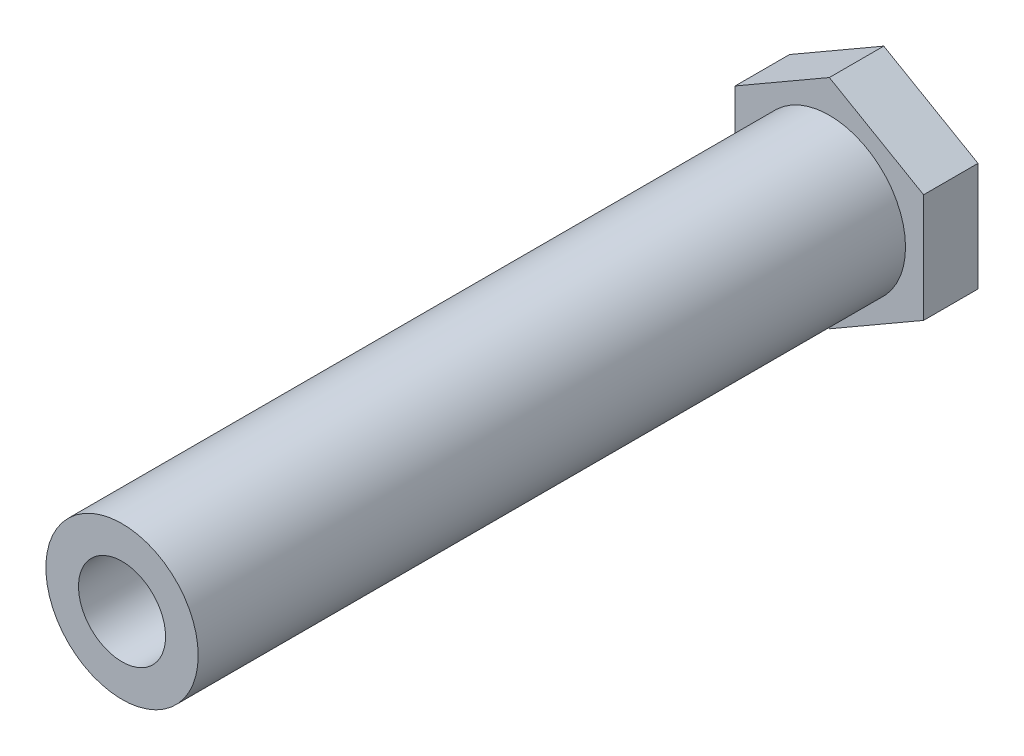
ISO-10303-21;
HEADER;
FILE_DESCRIPTION(('STEP AP214'),'2;1');
FILE_NAME('part.step','',(''),(''),'','','');
FILE_SCHEMA(('AUTOMOTIVE_DESIGN { 1 0 10303 214 1 1 1 1 }'));
ENDSEC;
DATA;
#1=APPLICATION_CONTEXT('core data for automotive mechanical design processes');
#2=APPLICATION_PROTOCOL_DEFINITION('international standard','automotive_design',2000,#1);
#3=PRODUCT_CONTEXT('',#1,'mechanical');
#4=PRODUCT('Part','Part','',(#3));
#5=PRODUCT_RELATED_PRODUCT_CATEGORY('part','',(#4));
#6=PRODUCT_DEFINITION_FORMATION('','',#4);
#7=PRODUCT_DEFINITION_CONTEXT('part definition',#1,'design');
#8=PRODUCT_DEFINITION('design','',#6,#7);
#9=PRODUCT_DEFINITION_SHAPE('','',#8);
#10=(LENGTH_UNIT() NAMED_UNIT(*) SI_UNIT(.MILLI.,.METRE.));
#11=(NAMED_UNIT(*) PLANE_ANGLE_UNIT() SI_UNIT($,.RADIAN.));
#12=(NAMED_UNIT(*) SI_UNIT($,.STERADIAN.) SOLID_ANGLE_UNIT());
#13=UNCERTAINTY_MEASURE_WITH_UNIT(LENGTH_MEASURE(1.E-05),#10,'distance_accuracy_value','');
#14=(GEOMETRIC_REPRESENTATION_CONTEXT(3) GLOBAL_UNCERTAINTY_ASSIGNED_CONTEXT((#13)) GLOBAL_UNIT_ASSIGNED_CONTEXT((#10,
#11,#12)) REPRESENTATION_CONTEXT('',''));
#15=CARTESIAN_POINT('',(0.,0.,0.));
#16=DIRECTION('',(0.,0.,1.));
#17=DIRECTION('',(1.,0.,0.));
#18=AXIS2_PLACEMENT_3D('',#15,#16,#17);
#19=CARTESIAN_POINT('',(8.66025403784438,0.,5.));
#20=DIRECTION('',(-1.,0.,0.));
#21=DIRECTION('',(0.,-1.,0.));
#22=AXIS2_PLACEMENT_3D('',#19,#20,#21);
#23=PLANE('',#22);
#24=DIRECTION('',(0.,1.,0.));
#25=VECTOR('',#24,1.);
#26=CARTESIAN_POINT('',(8.66025403784438,0.,0.));
#27=LINE('',#26,#25);
#28=CARTESIAN_POINT('',(8.66025403784443,-4.99999999999992,0.));
#29=VERTEX_POINT('',#28);
#30=CARTESIAN_POINT('',(8.66025403784433,5.0000000000001,0.));
#31=VERTEX_POINT('',#30);
#32=EDGE_CURVE('E130',#29,#31,#27,.T.);
#33=ORIENTED_EDGE('',*,*,#32,.T.);
#34=DIRECTION('',(0.,0.,-1.));
#35=VECTOR('',#34,1.);
#36=CARTESIAN_POINT('',(8.66025403784433,5.0000000000001,5.));
#37=LINE('',#36,#35);
#38=CARTESIAN_POINT('',(8.66025403784433,5.0000000000001,5.));
#39=VERTEX_POINT('',#38);
#40=EDGE_CURVE('E13',#39,#31,#37,.T.);
#41=ORIENTED_EDGE('',*,*,#40,.F.);
#42=DIRECTION('',(0.,1.,0.));
#43=VECTOR('',#42,1.);
#44=CARTESIAN_POINT('',(8.66025403784438,0.,5.));
#45=LINE('',#44,#43);
#46=CARTESIAN_POINT('',(8.66025403784443,-4.99999999999992,5.));
#47=VERTEX_POINT('',#46);
#48=EDGE_CURVE('E141',#47,#39,#45,.T.);
#49=ORIENTED_EDGE('',*,*,#48,.F.);
#50=DIRECTION('',(0.,0.,-1.));
#51=VECTOR('',#50,1.);
#52=CARTESIAN_POINT('',(8.66025403784443,-4.99999999999992,5.));
#53=LINE('',#52,#51);
#54=EDGE_CURVE('E126',#47,#29,#53,.T.);
#55=ORIENTED_EDGE('',*,*,#54,.T.);
#56=EDGE_LOOP('',(#33,#41,#49,#55));
#57=FACE_BOUND('',#56,.T.);
#58=ADVANCED_FACE('F46',(#57),#23,.F.);
#59=CARTESIAN_POINT('',(4.33012701892216,7.50000000000005,5.));
#60=DIRECTION('',(-0.499999999999995,-0.866025403784442,0.));
#61=DIRECTION('',(0.866025403784442,-0.499999999999995,0.));
#62=AXIS2_PLACEMENT_3D('',#59,#60,#61);
#63=PLANE('',#62);
#64=DIRECTION('',(-0.866025403784442,0.499999999999995,0.));
#65=VECTOR('',#64,1.);
#66=CARTESIAN_POINT('',(4.33012701892216,7.50000000000005,0.));
#67=LINE('',#66,#65);
#68=CARTESIAN_POINT('',(0.,10.,0.));
#69=VERTEX_POINT('',#68);
#70=EDGE_CURVE('E133',#31,#69,#67,.T.);
#71=ORIENTED_EDGE('',*,*,#70,.T.);
#72=DIRECTION('',(0.,0.,-1.));
#73=VECTOR('',#72,1.);
#74=CARTESIAN_POINT('',(0.,10.,5.));
#75=LINE('',#74,#73);
#76=CARTESIAN_POINT('',(0.,10.,5.));
#77=VERTEX_POINT('',#76);
#78=EDGE_CURVE('E54',#77,#69,#75,.T.);
#79=ORIENTED_EDGE('',*,*,#78,.F.);
#80=DIRECTION('',(-0.866025403784442,0.499999999999995,0.));
#81=VECTOR('',#80,1.);
#82=CARTESIAN_POINT('',(4.33012701892216,7.50000000000005,5.));
#83=LINE('',#82,#81);
#84=EDGE_CURVE('E99',#39,#77,#83,.T.);
#85=ORIENTED_EDGE('',*,*,#84,.F.);
#86=ORIENTED_EDGE('',*,*,#40,.T.);
#87=EDGE_LOOP('',(#71,#79,#85,#86));
#88=FACE_BOUND('',#87,.T.);
#89=ADVANCED_FACE('F166',(#88),#63,.F.);
#90=CARTESIAN_POINT('',(-4.3301270189222,7.49999999999999,5.));
#91=DIRECTION('',(0.500000000000001,-0.866025403784438,0.));
#92=DIRECTION('',(0.866025403784438,0.500000000000001,0.));
#93=AXIS2_PLACEMENT_3D('',#90,#91,#92);
#94=PLANE('',#93);
#95=DIRECTION('',(-0.866025403784438,-0.500000000000001,0.));
#96=VECTOR('',#95,1.);
#97=CARTESIAN_POINT('',(-4.3301270189222,7.49999999999999,0.));
#98=LINE('',#97,#96);
#99=CARTESIAN_POINT('',(-8.6602540378444,4.99999999999998,0.));
#100=VERTEX_POINT('',#99);
#101=EDGE_CURVE('E136',#69,#100,#98,.T.);
#102=ORIENTED_EDGE('',*,*,#101,.T.);
#103=DIRECTION('',(0.,0.,-1.));
#104=VECTOR('',#103,1.);
#105=CARTESIAN_POINT('',(-8.6602540378444,4.99999999999998,5.));
#106=LINE('',#105,#104);
#107=CARTESIAN_POINT('',(-8.6602540378444,4.99999999999998,5.));
#108=VERTEX_POINT('',#107);
#109=EDGE_CURVE('E121',#108,#100,#106,.T.);
#110=ORIENTED_EDGE('',*,*,#109,.F.);
#111=DIRECTION('',(-0.866025403784438,-0.500000000000001,0.));
#112=VECTOR('',#111,1.);
#113=CARTESIAN_POINT('',(-4.3301270189222,7.49999999999999,5.));
#114=LINE('',#113,#112);
#115=EDGE_CURVE('E112',#77,#108,#114,.T.);
#116=ORIENTED_EDGE('',*,*,#115,.F.);
#117=ORIENTED_EDGE('',*,*,#78,.T.);
#118=EDGE_LOOP('',(#102,#110,#116,#117));
#119=FACE_BOUND('',#118,.T.);
#120=ADVANCED_FACE('F147',(#119),#94,.F.);
#121=CARTESIAN_POINT('',(-8.66025403784438,0.,5.));
#122=DIRECTION('',(1.,0.,0.));
#123=DIRECTION('',(0.,1.,0.));
#124=AXIS2_PLACEMENT_3D('',#121,#122,#123);
#125=PLANE('',#124);
#126=DIRECTION('',(0.,-1.,0.));
#127=VECTOR('',#126,1.);
#128=CARTESIAN_POINT('',(-8.66025403784438,0.,0.));
#129=LINE('',#128,#127);
#130=CARTESIAN_POINT('',(-8.66025403784436,-5.00000000000004,0.));
#131=VERTEX_POINT('',#130);
#132=EDGE_CURVE('E120',#100,#131,#129,.T.);
#133=ORIENTED_EDGE('',*,*,#132,.T.);
#134=DIRECTION('',(0.,0.,-1.));
#135=VECTOR('',#134,1.);
#136=CARTESIAN_POINT('',(-8.66025403784436,-5.00000000000004,5.));
#137=LINE('',#136,#135);
#138=CARTESIAN_POINT('',(-8.66025403784436,-5.00000000000004,5.));
#139=VERTEX_POINT('',#138);
#140=EDGE_CURVE('E117',#139,#131,#137,.T.);
#141=ORIENTED_EDGE('',*,*,#140,.F.);
#142=DIRECTION('',(0.,-1.,0.));
#143=VECTOR('',#142,1.);
#144=CARTESIAN_POINT('',(-8.66025403784438,0.,5.));
#145=LINE('',#144,#143);
#146=EDGE_CURVE('E106',#108,#139,#145,.T.);
#147=ORIENTED_EDGE('',*,*,#146,.F.);
#148=ORIENTED_EDGE('',*,*,#109,.T.);
#149=EDGE_LOOP('',(#133,#141,#147,#148));
#150=FACE_BOUND('',#149,.T.);
#151=ADVANCED_FACE('F118',(#150),#125,.F.);
#152=CARTESIAN_POINT('',(-4.33012701892215,-7.50000000000002,5.));
#153=DIRECTION('',(0.499999999999995,0.866025403784442,0.));
#154=DIRECTION('',(-0.866025403784442,0.499999999999995,0.));
#155=AXIS2_PLACEMENT_3D('',#152,#153,#154);
#156=PLANE('',#155);
#157=DIRECTION('',(0.866025403784442,-0.499999999999995,0.));
#158=VECTOR('',#157,1.);
#159=CARTESIAN_POINT('',(-4.33012701892215,-7.50000000000002,0.));
#160=LINE('',#159,#158);
#161=CARTESIAN_POINT('',(0.,-10.,0.));
#162=VERTEX_POINT('',#161);
#163=EDGE_CURVE('E85',#131,#162,#160,.T.);
#164=ORIENTED_EDGE('',*,*,#163,.T.);
#165=DIRECTION('',(0.,0.,-1.));
#166=VECTOR('',#165,1.);
#167=CARTESIAN_POINT('',(0.,-10.,5.));
#168=LINE('',#167,#166);
#169=CARTESIAN_POINT('',(0.,-10.,5.));
#170=VERTEX_POINT('',#169);
#171=EDGE_CURVE('E122',#170,#162,#168,.T.);
#172=ORIENTED_EDGE('',*,*,#171,.F.);
#173=DIRECTION('',(0.866025403784442,-0.499999999999995,0.));
#174=VECTOR('',#173,1.);
#175=CARTESIAN_POINT('',(-4.33012701892215,-7.50000000000002,5.));
#176=LINE('',#175,#174);
#177=EDGE_CURVE('E110',#139,#170,#176,.T.);
#178=ORIENTED_EDGE('',*,*,#177,.F.);
#179=ORIENTED_EDGE('',*,*,#140,.T.);
#180=EDGE_LOOP('',(#164,#172,#178,#179));
#181=FACE_BOUND('',#180,.T.);
#182=ADVANCED_FACE('F124',(#181),#156,.F.);
#183=CARTESIAN_POINT('',(4.33012701892225,-7.49999999999996,5.));
#184=DIRECTION('',(-0.500000000000007,0.866025403784434,0.));
#185=DIRECTION('',(-0.866025403784435,-0.500000000000007,0.));
#186=AXIS2_PLACEMENT_3D('',#183,#184,#185);
#187=PLANE('',#186);
#188=DIRECTION('',(0.866025403784435,0.500000000000007,0.));
#189=VECTOR('',#188,1.);
#190=CARTESIAN_POINT('',(4.33012701892225,-7.49999999999996,0.));
#191=LINE('',#190,#189);
#192=EDGE_CURVE('E91',#162,#29,#191,.T.);
#193=ORIENTED_EDGE('',*,*,#192,.T.);
#194=ORIENTED_EDGE('',*,*,#54,.F.);
#195=DIRECTION('',(0.866025403784435,0.500000000000007,0.));
#196=VECTOR('',#195,1.);
#197=CARTESIAN_POINT('',(4.33012701892225,-7.49999999999996,5.));
#198=LINE('',#197,#196);
#199=EDGE_CURVE('E62',#170,#47,#198,.T.);
#200=ORIENTED_EDGE('',*,*,#199,.F.);
#201=ORIENTED_EDGE('',*,*,#171,.T.);
#202=EDGE_LOOP('',(#193,#194,#200,#201));
#203=FACE_BOUND('',#202,.T.);
#204=ADVANCED_FACE('F154',(#203),#187,.F.);
#205=CARTESIAN_POINT('',(0.,0.,5.));
#206=DIRECTION('',(0.,0.,1.));
#207=DIRECTION('',(1.,0.,0.));
#208=AXIS2_PLACEMENT_3D('',#205,#206,#207);
#209=PLANE('',#208);
#210=CARTESIAN_POINT('',(0.,0.,5.));
#211=DIRECTION('',(0.,0.,1.));
#212=DIRECTION('',(1.,0.,0.));
#213=AXIS2_PLACEMENT_3D('',#210,#211,#212);
#214=CIRCLE('',#213,7.);
#215=CARTESIAN_POINT('',(7.,0.,5.));
#216=VERTEX_POINT('',#215);
#217=EDGE_CURVE('E248',#216,#216,#214,.T.);
#218=ORIENTED_EDGE('',*,*,#217,.F.);
#219=EDGE_LOOP('',(#218));
#220=FACE_BOUND('',#219,.T.);
#221=ORIENTED_EDGE('',*,*,#48,.T.);
#222=ORIENTED_EDGE('',*,*,#84,.T.);
#223=ORIENTED_EDGE('',*,*,#115,.T.);
#224=ORIENTED_EDGE('',*,*,#146,.T.);
#225=ORIENTED_EDGE('',*,*,#177,.T.);
#226=ORIENTED_EDGE('',*,*,#199,.T.);
#227=EDGE_LOOP('',(#221,#222,#223,#224,#225,#226));
#228=FACE_BOUND('',#227,.T.);
#229=ADVANCED_FACE('F108',(#220,#228),#209,.T.);
#230=CARTESIAN_POINT('',(0.,0.,0.));
#231=DIRECTION('',(0.,0.,1.));
#232=DIRECTION('',(1.,0.,0.));
#233=AXIS2_PLACEMENT_3D('',#230,#231,#232);
#234=PLANE('',#233);
#235=ORIENTED_EDGE('',*,*,#32,.F.);
#236=ORIENTED_EDGE('',*,*,#192,.F.);
#237=ORIENTED_EDGE('',*,*,#163,.F.);
#238=ORIENTED_EDGE('',*,*,#132,.F.);
#239=ORIENTED_EDGE('',*,*,#101,.F.);
#240=ORIENTED_EDGE('',*,*,#70,.F.);
#241=EDGE_LOOP('',(#235,#236,#237,#238,#239,#240));
#242=FACE_BOUND('',#241,.T.);
#243=ADVANCED_FACE('F150',(#242),#234,.F.);
#244=CARTESIAN_POINT('',(0.,0.,70.));
#245=DIRECTION('',(0.,0.,-1.));
#246=DIRECTION('',(-1.,0.,0.));
#247=AXIS2_PLACEMENT_3D('',#244,#245,#246);
#248=CYLINDRICAL_SURFACE('',#247,7.);
#249=CARTESIAN_POINT('',(0.,0.,70.));
#250=DIRECTION('',(0.,0.,1.));
#251=DIRECTION('',(1.,0.,0.));
#252=AXIS2_PLACEMENT_3D('',#249,#250,#251);
#253=CIRCLE('',#252,7.);
#254=CARTESIAN_POINT('',(7.,0.,70.));
#255=VERTEX_POINT('',#254);
#256=EDGE_CURVE('E134',#255,#255,#253,.T.);
#257=ORIENTED_EDGE('',*,*,#256,.F.);
#258=EDGE_LOOP('',(#257));
#259=FACE_BOUND('',#258,.T.);
#260=ORIENTED_EDGE('',*,*,#217,.T.);
#261=EDGE_LOOP('',(#260));
#262=FACE_BOUND('',#261,.T.);
#263=ADVANCED_FACE('F198',(#259,#262),#248,.T.);
#264=CARTESIAN_POINT('',(0.,0.,70.));
#265=DIRECTION('',(0.,0.,1.));
#266=DIRECTION('',(1.,0.,0.));
#267=AXIS2_PLACEMENT_3D('',#264,#265,#266);
#268=PLANE('',#267);
#269=CARTESIAN_POINT('',(0.,0.,70.));
#270=DIRECTION('',(0.,0.,1.));
#271=DIRECTION('',(1.,0.,0.));
#272=AXIS2_PLACEMENT_3D('',#269,#270,#271);
#273=CIRCLE('',#272,4.);
#274=CARTESIAN_POINT('',(4.,0.,70.));
#275=VERTEX_POINT('',#274);
#276=EDGE_CURVE('E249',#275,#275,#273,.T.);
#277=ORIENTED_EDGE('',*,*,#276,.F.);
#278=EDGE_LOOP('',(#277));
#279=FACE_BOUND('',#278,.T.);
#280=ORIENTED_EDGE('',*,*,#256,.T.);
#281=EDGE_LOOP('',(#280));
#282=FACE_BOUND('',#281,.T.);
#283=ADVANCED_FACE('F211',(#279,#282),#268,.T.);
#284=CARTESIAN_POINT('',(0.,0.,50.));
#285=DIRECTION('',(0.,0.,1.));
#286=DIRECTION('',(1.,0.,0.));
#287=AXIS2_PLACEMENT_3D('',#284,#285,#286);
#288=CYLINDRICAL_SURFACE('',#287,4.);
#289=CARTESIAN_POINT('',(0.,0.,50.));
#290=DIRECTION('',(0.,0.,1.));
#291=DIRECTION('',(1.,0.,0.));
#292=AXIS2_PLACEMENT_3D('',#289,#290,#291);
#293=CIRCLE('',#292,4.);
#294=CARTESIAN_POINT('',(4.,0.,50.));
#295=VERTEX_POINT('',#294);
#296=EDGE_CURVE('E247',#295,#295,#293,.T.);
#297=ORIENTED_EDGE('',*,*,#296,.F.);
#298=EDGE_LOOP('',(#297));
#299=FACE_BOUND('',#298,.T.);
#300=ORIENTED_EDGE('',*,*,#276,.T.);
#301=EDGE_LOOP('',(#300));
#302=FACE_BOUND('',#301,.T.);
#303=ADVANCED_FACE('F221',(#299,#302),#288,.F.);
#304=CARTESIAN_POINT('',(0.,0.,50.));
#305=DIRECTION('',(0.,0.,1.));
#306=DIRECTION('',(1.,0.,0.));
#307=AXIS2_PLACEMENT_3D('',#304,#305,#306);
#308=PLANE('',#307);
#309=ORIENTED_EDGE('',*,*,#296,.T.);
#310=EDGE_LOOP('',(#309));
#311=FACE_BOUND('',#310,.T.);
#312=ADVANCED_FACE('F231',(#311),#308,.T.);
#313=CLOSED_SHELL('',(#58,#89,#120,#151,#182,#204,#229,#243,#263,#283,#303,#312));
#314=MANIFOLD_SOLID_BREP('B2',#313);
#315=ADVANCED_BREP_SHAPE_REPRESENTATION('',(#18,#314),#14);
#316=SHAPE_DEFINITION_REPRESENTATION(#9,#315);
ENDSEC;
END-ISO-10303-21;
